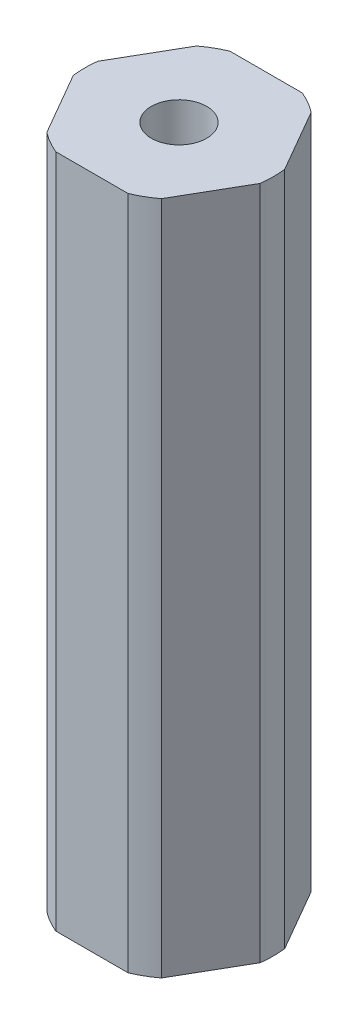
ISO-10303-21;
HEADER;
FILE_DESCRIPTION(('STEP AP214'),'2;1');
FILE_NAME('part.step','',(''),(''),'','','');
FILE_SCHEMA(('AUTOMOTIVE_DESIGN { 1 0 10303 214 1 1 1 1 }'));
ENDSEC;
DATA;
#1=APPLICATION_CONTEXT('core data for automotive mechanical design processes');
#2=APPLICATION_PROTOCOL_DEFINITION('international standard','automotive_design',2000,#1);
#3=PRODUCT_CONTEXT('',#1,'mechanical');
#4=PRODUCT('Part','Part','',(#3));
#5=PRODUCT_RELATED_PRODUCT_CATEGORY('part','',(#4));
#6=PRODUCT_DEFINITION_FORMATION('','',#4);
#7=PRODUCT_DEFINITION_CONTEXT('part definition',#1,'design');
#8=PRODUCT_DEFINITION('design','',#6,#7);
#9=PRODUCT_DEFINITION_SHAPE('','',#8);
#10=(LENGTH_UNIT() NAMED_UNIT(*) SI_UNIT(.MILLI.,.METRE.));
#11=(NAMED_UNIT(*) PLANE_ANGLE_UNIT() SI_UNIT($,.RADIAN.));
#12=(NAMED_UNIT(*) SI_UNIT($,.STERADIAN.) SOLID_ANGLE_UNIT());
#13=UNCERTAINTY_MEASURE_WITH_UNIT(LENGTH_MEASURE(1.E-05),#10,'distance_accuracy_value','');
#14=(GEOMETRIC_REPRESENTATION_CONTEXT(3) GLOBAL_UNCERTAINTY_ASSIGNED_CONTEXT((#13)) GLOBAL_UNIT_ASSIGNED_CONTEXT((#10,
#11,#12)) REPRESENTATION_CONTEXT('',''));
#15=CARTESIAN_POINT('',(0.,0.,0.));
#16=DIRECTION('',(0.,0.,1.));
#17=DIRECTION('',(1.,0.,0.));
#18=AXIS2_PLACEMENT_3D('',#15,#16,#17);
#19=CARTESIAN_POINT('',(5.49926131403119,49.2125,3.175));
#20=DIRECTION('',(0.866025403784439,0.,0.5));
#21=DIRECTION('',(0.5,0.,-0.866025403784439));
#22=AXIS2_PLACEMENT_3D('',#19,#20,#21);
#23=PLANE('',#22);
#24=DIRECTION('',(-0.5,0.,0.866025403784439));
#25=VECTOR('',#24,1.);
#26=CARTESIAN_POINT('',(5.49926131403119,49.2125,3.175));
#27=LINE('',#26,#25);
#28=CARTESIAN_POINT('',(6.81675182633099,49.2125,0.893039494206794));
#29=VERTEX_POINT('',#28);
#30=CARTESIAN_POINT('',(4.18177080173138,49.2125,5.45696050579321));
#31=VERTEX_POINT('',#30);
#32=EDGE_CURVE('E142',#29,#31,#27,.T.);
#33=ORIENTED_EDGE('',*,*,#32,.T.);
#34=DIRECTION('',(0.,-1.,0.));
#35=VECTOR('',#34,1.);
#36=CARTESIAN_POINT('',(4.18177080173138,53.4139026936859,5.45696050579321));
#37=LINE('',#36,#35);
#38=CARTESIAN_POINT('',(4.18177080173138,0.,5.45696050579321));
#39=VERTEX_POINT('',#38);
#40=EDGE_CURVE('E190',#31,#39,#37,.T.);
#41=ORIENTED_EDGE('',*,*,#40,.T.);
#42=DIRECTION('',(-0.5,0.,0.866025403784439));
#43=VECTOR('',#42,1.);
#44=CARTESIAN_POINT('',(5.49926131403119,0.,3.175));
#45=LINE('',#44,#43);
#46=CARTESIAN_POINT('',(6.81675182633099,0.,0.893039494206794));
#47=VERTEX_POINT('',#46);
#48=EDGE_CURVE('E131',#47,#39,#45,.T.);
#49=ORIENTED_EDGE('',*,*,#48,.F.);
#50=DIRECTION('',(0.,-1.,0.));
#51=VECTOR('',#50,1.);
#52=CARTESIAN_POINT('',(6.81675182633099,53.4139026936859,0.893039494206792));
#53=LINE('',#52,#51);
#54=EDGE_CURVE('E181',#47,#29,#53,.F.);
#55=ORIENTED_EDGE('',*,*,#54,.T.);
#56=EDGE_LOOP('',(#33,#41,#49,#55));
#57=FACE_BOUND('',#56,.T.);
#58=ADVANCED_FACE('F17',(#57),#23,.T.);
#59=CARTESIAN_POINT('',(0.,49.2125,6.35));
#60=DIRECTION('',(0.,0.,1.));
#61=DIRECTION('',(1.,0.,0.));
#62=AXIS2_PLACEMENT_3D('',#59,#60,#61);
#63=PLANE('',#62);
#64=DIRECTION('',(-1.,0.,0.));
#65=VECTOR('',#64,1.);
#66=CARTESIAN_POINT('',(0.,49.2125,6.35));
#67=LINE('',#66,#65);
#68=CARTESIAN_POINT('',(2.63498102459961,49.2125,6.35));
#69=VERTEX_POINT('',#68);
#70=CARTESIAN_POINT('',(-2.63498102459961,49.2125,6.35));
#71=VERTEX_POINT('',#70);
#72=EDGE_CURVE('E171',#69,#71,#67,.T.);
#73=ORIENTED_EDGE('',*,*,#72,.T.);
#74=DIRECTION('',(0.,-1.,0.));
#75=VECTOR('',#74,1.);
#76=CARTESIAN_POINT('',(-2.63498102459961,53.4139026936859,6.35));
#77=LINE('',#76,#75);
#78=CARTESIAN_POINT('',(-2.63498102459961,0.,6.35));
#79=VERTEX_POINT('',#78);
#80=EDGE_CURVE('E35',#71,#79,#77,.T.);
#81=ORIENTED_EDGE('',*,*,#80,.T.);
#82=DIRECTION('',(-1.,0.,0.));
#83=VECTOR('',#82,1.);
#84=CARTESIAN_POINT('',(0.,0.,6.35));
#85=LINE('',#84,#83);
#86=CARTESIAN_POINT('',(2.63498102459961,0.,6.35));
#87=VERTEX_POINT('',#86);
#88=EDGE_CURVE('E150',#87,#79,#85,.T.);
#89=ORIENTED_EDGE('',*,*,#88,.F.);
#90=DIRECTION('',(0.,-1.,0.));
#91=VECTOR('',#90,1.);
#92=CARTESIAN_POINT('',(2.63498102459961,53.4139026936859,6.35));
#93=LINE('',#92,#91);
#94=EDGE_CURVE('E194',#87,#69,#93,.F.);
#95=ORIENTED_EDGE('',*,*,#94,.T.);
#96=EDGE_LOOP('',(#73,#81,#89,#95));
#97=FACE_BOUND('',#96,.T.);
#98=ADVANCED_FACE('F251',(#97),#63,.T.);
#99=CARTESIAN_POINT('',(-5.49926131403119,49.2125,3.175));
#100=DIRECTION('',(-0.866025403784439,0.,0.5));
#101=DIRECTION('',(0.5,0.,0.866025403784439));
#102=AXIS2_PLACEMENT_3D('',#99,#100,#101);
#103=PLANE('',#102);
#104=DIRECTION('',(-0.5,0.,-0.866025403784439));
#105=VECTOR('',#104,1.);
#106=CARTESIAN_POINT('',(-5.49926131403119,49.2125,3.175));
#107=LINE('',#106,#105);
#108=CARTESIAN_POINT('',(-4.18177080173138,49.2125,5.45696050579321));
#109=VERTEX_POINT('',#108);
#110=CARTESIAN_POINT('',(-6.81675182633099,49.2125,0.893039494206794));
#111=VERTEX_POINT('',#110);
#112=EDGE_CURVE('E167',#109,#111,#107,.T.);
#113=ORIENTED_EDGE('',*,*,#112,.T.);
#114=DIRECTION('',(0.,-1.,0.));
#115=VECTOR('',#114,1.);
#116=CARTESIAN_POINT('',(-6.81675182633099,53.4139026936859,0.893039494206792));
#117=LINE('',#116,#115);
#118=CARTESIAN_POINT('',(-6.81675182633099,0.,0.893039494206794));
#119=VERTEX_POINT('',#118);
#120=EDGE_CURVE('E43',#111,#119,#117,.T.);
#121=ORIENTED_EDGE('',*,*,#120,.T.);
#122=DIRECTION('',(-0.5,0.,-0.866025403784439));
#123=VECTOR('',#122,1.);
#124=CARTESIAN_POINT('',(-5.49926131403119,0.,3.175));
#125=LINE('',#124,#123);
#126=CARTESIAN_POINT('',(-4.18177080173138,0.,5.45696050579321));
#127=VERTEX_POINT('',#126);
#128=EDGE_CURVE('E144',#127,#119,#125,.T.);
#129=ORIENTED_EDGE('',*,*,#128,.F.);
#130=DIRECTION('',(0.,-1.,0.));
#131=VECTOR('',#130,1.);
#132=CARTESIAN_POINT('',(-4.18177080173138,53.4139026936859,5.45696050579321));
#133=LINE('',#132,#131);
#134=EDGE_CURVE('E201',#127,#109,#133,.F.);
#135=ORIENTED_EDGE('',*,*,#134,.T.);
#136=EDGE_LOOP('',(#113,#121,#129,#135));
#137=FACE_BOUND('',#136,.T.);
#138=ADVANCED_FACE('F257',(#137),#103,.T.);
#139=CARTESIAN_POINT('',(-5.49926131403119,49.2125,-3.175));
#140=DIRECTION('',(-0.866025403784439,0.,-0.5));
#141=DIRECTION('',(-0.5,0.,0.866025403784439));
#142=AXIS2_PLACEMENT_3D('',#139,#140,#141);
#143=PLANE('',#142);
#144=DIRECTION('',(0.5,0.,-0.866025403784439));
#145=VECTOR('',#144,1.);
#146=CARTESIAN_POINT('',(-5.49926131403119,49.2125,-3.175));
#147=LINE('',#146,#145);
#148=CARTESIAN_POINT('',(-6.81675182633099,49.2125,-0.893039494206793));
#149=VERTEX_POINT('',#148);
#150=CARTESIAN_POINT('',(-4.18177080173138,49.2125,-5.45696050579321));
#151=VERTEX_POINT('',#150);
#152=EDGE_CURVE('E163',#149,#151,#147,.T.);
#153=ORIENTED_EDGE('',*,*,#152,.T.);
#154=DIRECTION('',(0.,-1.,0.));
#155=VECTOR('',#154,1.);
#156=CARTESIAN_POINT('',(-4.18177080173138,53.4139026936859,-5.45696050579321));
#157=LINE('',#156,#155);
#158=CARTESIAN_POINT('',(-4.18177080173138,0.,-5.45696050579321));
#159=VERTEX_POINT('',#158);
#160=EDGE_CURVE('E213',#151,#159,#157,.T.);
#161=ORIENTED_EDGE('',*,*,#160,.T.);
#162=DIRECTION('',(0.5,0.,-0.866025403784439));
#163=VECTOR('',#162,1.);
#164=CARTESIAN_POINT('',(-5.49926131403119,0.,-3.175));
#165=LINE('',#164,#163);
#166=CARTESIAN_POINT('',(-6.81675182633099,0.,-0.893039494206793));
#167=VERTEX_POINT('',#166);
#168=EDGE_CURVE('E137',#167,#159,#165,.T.);
#169=ORIENTED_EDGE('',*,*,#168,.F.);
#170=DIRECTION('',(0.,-1.,0.));
#171=VECTOR('',#170,1.);
#172=CARTESIAN_POINT('',(-6.81675182633099,53.4139026936859,-0.893039494206793));
#173=LINE('',#172,#171);
#174=EDGE_CURVE('E208',#167,#149,#173,.F.);
#175=ORIENTED_EDGE('',*,*,#174,.T.);
#176=EDGE_LOOP('',(#153,#161,#169,#175));
#177=FACE_BOUND('',#176,.T.);
#178=ADVANCED_FACE('F332',(#177),#143,.T.);
#179=CARTESIAN_POINT('',(0.,49.2125,-6.35));
#180=DIRECTION('',(0.,0.,-1.));
#181=DIRECTION('',(-1.,0.,0.));
#182=AXIS2_PLACEMENT_3D('',#179,#180,#181);
#183=PLANE('',#182);
#184=DIRECTION('',(1.,0.,0.));
#185=VECTOR('',#184,1.);
#186=CARTESIAN_POINT('',(0.,49.2125,-6.35));
#187=LINE('',#186,#185);
#188=CARTESIAN_POINT('',(-2.63498102459961,49.2125,-6.35));
#189=VERTEX_POINT('',#188);
#190=CARTESIAN_POINT('',(2.63498102459961,49.2125,-6.35));
#191=VERTEX_POINT('',#190);
#192=EDGE_CURVE('E129',#189,#191,#187,.T.);
#193=ORIENTED_EDGE('',*,*,#192,.T.);
#194=DIRECTION('',(0.,-1.,0.));
#195=VECTOR('',#194,1.);
#196=CARTESIAN_POINT('',(2.63498102459961,53.4139026936859,-6.35));
#197=LINE('',#196,#195);
#198=CARTESIAN_POINT('',(2.63498102459961,0.,-6.35));
#199=VERTEX_POINT('',#198);
#200=EDGE_CURVE('E110',#191,#199,#197,.T.);
#201=ORIENTED_EDGE('',*,*,#200,.T.);
#202=DIRECTION('',(1.,0.,0.));
#203=VECTOR('',#202,1.);
#204=CARTESIAN_POINT('',(0.,0.,-6.35));
#205=LINE('',#204,#203);
#206=CARTESIAN_POINT('',(-2.63498102459961,0.,-6.35));
#207=VERTEX_POINT('',#206);
#208=EDGE_CURVE('E127',#207,#199,#205,.T.);
#209=ORIENTED_EDGE('',*,*,#208,.F.);
#210=DIRECTION('',(0.,-1.,0.));
#211=VECTOR('',#210,1.);
#212=CARTESIAN_POINT('',(-2.63498102459961,53.4139026936859,-6.35));
#213=LINE('',#212,#211);
#214=EDGE_CURVE('E217',#207,#189,#213,.F.);
#215=ORIENTED_EDGE('',*,*,#214,.T.);
#216=EDGE_LOOP('',(#193,#201,#209,#215));
#217=FACE_BOUND('',#216,.T.);
#218=ADVANCED_FACE('F125',(#217),#183,.T.);
#219=CARTESIAN_POINT('',(5.49926131403119,49.2125,-3.175));
#220=DIRECTION('',(0.866025403784438,0.,-0.5));
#221=DIRECTION('',(-0.5,0.,-0.866025403784439));
#222=AXIS2_PLACEMENT_3D('',#219,#220,#221);
#223=PLANE('',#222);
#224=DIRECTION('',(0.5,0.,0.866025403784439));
#225=VECTOR('',#224,1.);
#226=CARTESIAN_POINT('',(5.49926131403119,49.2125,-3.175));
#227=LINE('',#226,#225);
#228=CARTESIAN_POINT('',(4.18177080173138,49.2125,-5.45696050579321));
#229=VERTEX_POINT('',#228);
#230=CARTESIAN_POINT('',(6.81675182633099,49.2125,-0.893039494206797));
#231=VERTEX_POINT('',#230);
#232=EDGE_CURVE('E157',#229,#231,#227,.T.);
#233=ORIENTED_EDGE('',*,*,#232,.T.);
#234=DIRECTION('',(0.,-1.,0.));
#235=VECTOR('',#234,1.);
#236=CARTESIAN_POINT('',(6.81675182633099,53.4139026936859,-0.893039494206793));
#237=LINE('',#236,#235);
#238=CARTESIAN_POINT('',(6.81675182633099,0.,-0.893039494206797));
#239=VERTEX_POINT('',#238);
#240=EDGE_CURVE('E185',#231,#239,#237,.T.);
#241=ORIENTED_EDGE('',*,*,#240,.T.);
#242=DIRECTION('',(0.5,0.,0.866025403784439));
#243=VECTOR('',#242,1.);
#244=CARTESIAN_POINT('',(5.49926131403119,0.,-3.175));
#245=LINE('',#244,#243);
#246=CARTESIAN_POINT('',(4.18177080173138,0.,-5.45696050579321));
#247=VERTEX_POINT('',#246);
#248=EDGE_CURVE('E20',#247,#239,#245,.T.);
#249=ORIENTED_EDGE('',*,*,#248,.F.);
#250=DIRECTION('',(0.,-1.,0.));
#251=VECTOR('',#250,1.);
#252=CARTESIAN_POINT('',(4.18177080173138,53.4139026936859,-5.45696050579321));
#253=LINE('',#252,#251);
#254=EDGE_CURVE('E113',#247,#229,#253,.F.);
#255=ORIENTED_EDGE('',*,*,#254,.T.);
#256=EDGE_LOOP('',(#233,#241,#249,#255));
#257=FACE_BOUND('',#256,.T.);
#258=ADVANCED_FACE('F246',(#257),#223,.T.);
#259=CARTESIAN_POINT('',(0.,49.2125,0.));
#260=DIRECTION('',(0.,-1.,0.));
#261=DIRECTION('',(1.,0.,0.));
#262=AXIS2_PLACEMENT_3D('',#259,#260,#261);
#263=PLANE('',#262);
#264=CARTESIAN_POINT('',(0.,49.2125,0.));
#265=DIRECTION('',(0.,-1.,0.));
#266=DIRECTION('',(0.,0.,-1.));
#267=AXIS2_PLACEMENT_3D('',#264,#265,#266);
#268=CIRCLE('',#267,2.0193);
#269=CARTESIAN_POINT('',(0.,49.2125,-2.0193));
#270=VERTEX_POINT('',#269);
#271=EDGE_CURVE('E120',#270,#270,#268,.T.);
#272=ORIENTED_EDGE('',*,*,#271,.T.);
#273=EDGE_LOOP('',(#272));
#274=FACE_BOUND('',#273,.T.);
#275=CARTESIAN_POINT('',(0.,49.2125,0.));
#276=DIRECTION('',(0.,-1.,0.));
#277=DIRECTION('',(0.,0.,-1.));
#278=AXIS2_PLACEMENT_3D('',#275,#276,#277);
#279=CIRCLE('',#278,6.875);
#280=EDGE_CURVE('E180',#191,#229,#279,.T.);
#281=ORIENTED_EDGE('',*,*,#280,.F.);
#282=ORIENTED_EDGE('',*,*,#192,.F.);
#283=EDGE_CURVE('E119',#151,#189,#279,.T.);
#284=ORIENTED_EDGE('',*,*,#283,.F.);
#285=ORIENTED_EDGE('',*,*,#152,.F.);
#286=EDGE_CURVE('E212',#111,#149,#279,.T.);
#287=ORIENTED_EDGE('',*,*,#286,.F.);
#288=ORIENTED_EDGE('',*,*,#112,.F.);
#289=EDGE_CURVE('E205',#71,#109,#279,.T.);
#290=ORIENTED_EDGE('',*,*,#289,.F.);
#291=ORIENTED_EDGE('',*,*,#72,.F.);
#292=EDGE_CURVE('E198',#31,#69,#279,.T.);
#293=ORIENTED_EDGE('',*,*,#292,.F.);
#294=ORIENTED_EDGE('',*,*,#32,.F.);
#295=EDGE_CURVE('E189',#231,#29,#279,.T.);
#296=ORIENTED_EDGE('',*,*,#295,.F.);
#297=ORIENTED_EDGE('',*,*,#232,.F.);
#298=EDGE_LOOP('',(#281,#282,#284,#285,#287,#288,#290,#291,#293,#294,#296,#297));
#299=FACE_BOUND('',#298,.T.);
#300=ADVANCED_FACE('F236',(#274,#299),#263,.F.);
#301=CARTESIAN_POINT('',(0.,0.,0.));
#302=DIRECTION('',(0.,-1.,0.));
#303=DIRECTION('',(1.,0.,0.));
#304=AXIS2_PLACEMENT_3D('',#301,#302,#303);
#305=PLANE('',#304);
#306=CARTESIAN_POINT('',(0.,0.,0.));
#307=DIRECTION('',(0.,-1.,0.));
#308=DIRECTION('',(0.,0.,-1.));
#309=AXIS2_PLACEMENT_3D('',#306,#307,#308);
#310=CIRCLE('',#309,2.0193);
#311=CARTESIAN_POINT('',(0.,0.,-2.0193));
#312=VERTEX_POINT('',#311);
#313=EDGE_CURVE('E225',#312,#312,#310,.T.);
#314=ORIENTED_EDGE('',*,*,#313,.F.);
#315=EDGE_LOOP('',(#314));
#316=FACE_BOUND('',#315,.T.);
#317=ORIENTED_EDGE('',*,*,#208,.T.);
#318=CARTESIAN_POINT('',(0.,0.,0.));
#319=DIRECTION('',(0.,-1.,0.));
#320=DIRECTION('',(0.,0.,-1.));
#321=AXIS2_PLACEMENT_3D('',#318,#319,#320);
#322=CIRCLE('',#321,6.875);
#323=EDGE_CURVE('E28',#199,#247,#322,.T.);
#324=ORIENTED_EDGE('',*,*,#323,.T.);
#325=ORIENTED_EDGE('',*,*,#248,.T.);
#326=EDGE_CURVE('E11',#239,#47,#322,.T.);
#327=ORIENTED_EDGE('',*,*,#326,.T.);
#328=ORIENTED_EDGE('',*,*,#48,.T.);
#329=EDGE_CURVE('E26',#39,#87,#322,.T.);
#330=ORIENTED_EDGE('',*,*,#329,.T.);
#331=ORIENTED_EDGE('',*,*,#88,.T.);
#332=EDGE_CURVE('E468',#79,#127,#322,.T.);
#333=ORIENTED_EDGE('',*,*,#332,.T.);
#334=ORIENTED_EDGE('',*,*,#128,.T.);
#335=EDGE_CURVE('E466',#119,#167,#322,.T.);
#336=ORIENTED_EDGE('',*,*,#335,.T.);
#337=ORIENTED_EDGE('',*,*,#168,.T.);
#338=EDGE_CURVE('E121',#159,#207,#322,.T.);
#339=ORIENTED_EDGE('',*,*,#338,.T.);
#340=EDGE_LOOP('',(#317,#324,#325,#327,#328,#330,#331,#333,#334,#336,#337,#339));
#341=FACE_BOUND('',#340,.T.);
#342=ADVANCED_FACE('F134',(#316,#341),#305,.T.);
#343=CARTESIAN_POINT('',(0.,53.4139026936859,0.));
#344=DIRECTION('',(0.,-1.,0.));
#345=DIRECTION('',(0.,0.,-1.));
#346=AXIS2_PLACEMENT_3D('',#343,#344,#345);
#347=CYLINDRICAL_SURFACE('',#346,6.875);
#348=ORIENTED_EDGE('',*,*,#283,.T.);
#349=ORIENTED_EDGE('',*,*,#214,.F.);
#350=ORIENTED_EDGE('',*,*,#338,.F.);
#351=ORIENTED_EDGE('',*,*,#160,.F.);
#352=EDGE_LOOP('',(#348,#349,#350,#351));
#353=FACE_BOUND('',#352,.T.);
#354=ADVANCED_FACE('F235',(#353),#347,.T.);
#355=ORIENTED_EDGE('',*,*,#286,.T.);
#356=ORIENTED_EDGE('',*,*,#174,.F.);
#357=ORIENTED_EDGE('',*,*,#335,.F.);
#358=ORIENTED_EDGE('',*,*,#120,.F.);
#359=EDGE_LOOP('',(#355,#356,#357,#358));
#360=FACE_BOUND('',#359,.T.);
#361=ADVANCED_FACE('F243',(#360),#347,.T.);
#362=ORIENTED_EDGE('',*,*,#289,.T.);
#363=ORIENTED_EDGE('',*,*,#134,.F.);
#364=ORIENTED_EDGE('',*,*,#332,.F.);
#365=ORIENTED_EDGE('',*,*,#80,.F.);
#366=EDGE_LOOP('',(#362,#363,#364,#365));
#367=FACE_BOUND('',#366,.T.);
#368=ADVANCED_FACE('F281',(#367),#347,.T.);
#369=ORIENTED_EDGE('',*,*,#292,.T.);
#370=ORIENTED_EDGE('',*,*,#94,.F.);
#371=ORIENTED_EDGE('',*,*,#329,.F.);
#372=ORIENTED_EDGE('',*,*,#40,.F.);
#373=EDGE_LOOP('',(#369,#370,#371,#372));
#374=FACE_BOUND('',#373,.T.);
#375=ADVANCED_FACE('F276',(#374),#347,.T.);
#376=ORIENTED_EDGE('',*,*,#326,.F.);
#377=ORIENTED_EDGE('',*,*,#240,.F.);
#378=ORIENTED_EDGE('',*,*,#295,.T.);
#379=ORIENTED_EDGE('',*,*,#54,.F.);
#380=EDGE_LOOP('',(#376,#377,#378,#379));
#381=FACE_BOUND('',#380,.T.);
#382=ADVANCED_FACE('F274',(#381),#347,.T.);
#383=ORIENTED_EDGE('',*,*,#280,.T.);
#384=ORIENTED_EDGE('',*,*,#254,.F.);
#385=ORIENTED_EDGE('',*,*,#323,.F.);
#386=ORIENTED_EDGE('',*,*,#200,.F.);
#387=EDGE_LOOP('',(#383,#384,#385,#386));
#388=FACE_BOUND('',#387,.T.);
#389=ADVANCED_FACE('F109',(#388),#347,.T.);
#390=CARTESIAN_POINT('',(0.,52.661900784777,0.));
#391=DIRECTION('',(0.,-1.,0.));
#392=DIRECTION('',(0.,0.,-1.));
#393=AXIS2_PLACEMENT_3D('',#390,#391,#392);
#394=CYLINDRICAL_SURFACE('',#393,2.0193);
#395=ORIENTED_EDGE('',*,*,#313,.T.);
#396=EDGE_LOOP('',(#395));
#397=FACE_BOUND('',#396,.T.);
#398=ORIENTED_EDGE('',*,*,#271,.F.);
#399=EDGE_LOOP('',(#398));
#400=FACE_BOUND('',#399,.T.);
#401=ADVANCED_FACE('F231',(#397,#400),#394,.F.);
#402=CLOSED_SHELL('',(#58,#98,#138,#178,#218,#258,#300,#342,#354,#361,#368,#375,#382,#389,#401));
#403=MANIFOLD_SOLID_BREP('B1',#402);
#404=ADVANCED_BREP_SHAPE_REPRESENTATION('',(#18,#403),#14);
#405=SHAPE_DEFINITION_REPRESENTATION(#9,#404);
ENDSEC;
END-ISO-10303-21;
